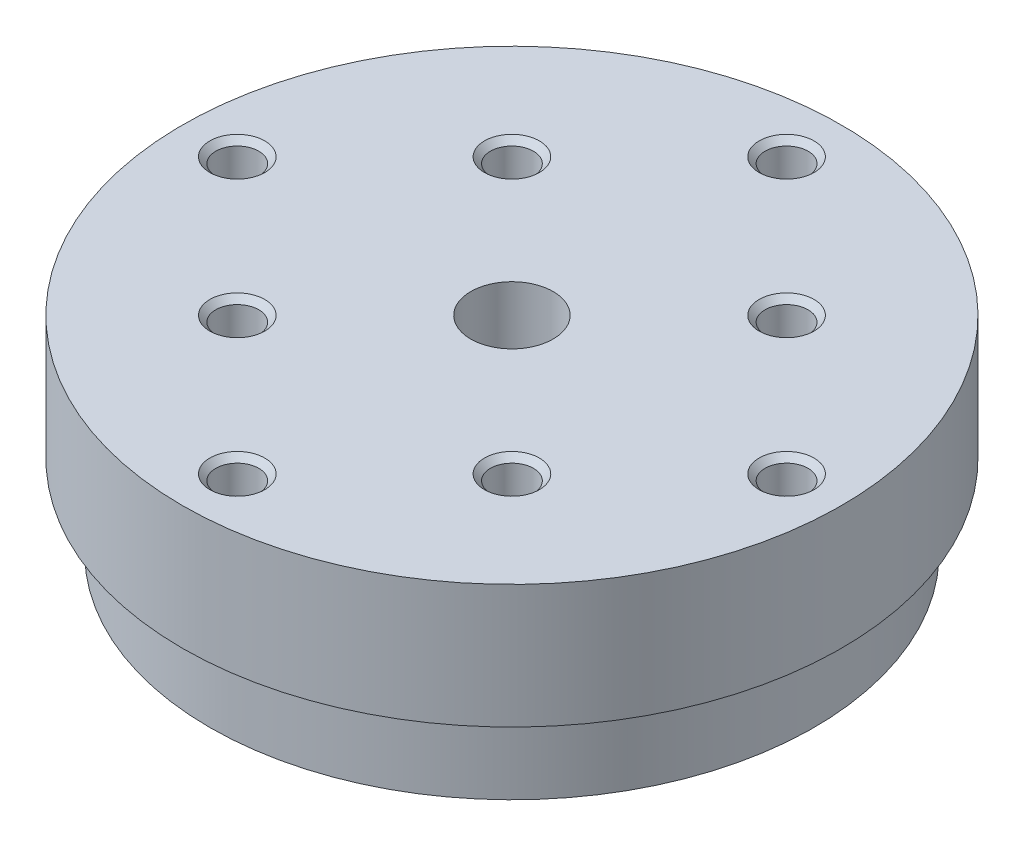
ISO-10303-21;
HEADER;
FILE_DESCRIPTION(('STEP AP214'),'2;1');
FILE_NAME('part.step','',(''),(''),'','','');
FILE_SCHEMA(('AUTOMOTIVE_DESIGN { 1 0 10303 214 1 1 1 1 }'));
ENDSEC;
DATA;
#1=APPLICATION_CONTEXT('core data for automotive mechanical design processes');
#2=APPLICATION_PROTOCOL_DEFINITION('international standard','automotive_design',2000,#1);
#3=PRODUCT_CONTEXT('',#1,'mechanical');
#4=PRODUCT('Part','Part','',(#3));
#5=PRODUCT_RELATED_PRODUCT_CATEGORY('part','',(#4));
#6=PRODUCT_DEFINITION_FORMATION('','',#4);
#7=PRODUCT_DEFINITION_CONTEXT('part definition',#1,'design');
#8=PRODUCT_DEFINITION('design','',#6,#7);
#9=PRODUCT_DEFINITION_SHAPE('','',#8);
#10=(LENGTH_UNIT() NAMED_UNIT(*) SI_UNIT(.MILLI.,.METRE.));
#11=(NAMED_UNIT(*) PLANE_ANGLE_UNIT() SI_UNIT($,.RADIAN.));
#12=(NAMED_UNIT(*) SI_UNIT($,.STERADIAN.) SOLID_ANGLE_UNIT());
#13=UNCERTAINTY_MEASURE_WITH_UNIT(LENGTH_MEASURE(1.E-05),#10,'distance_accuracy_value','');
#14=(GEOMETRIC_REPRESENTATION_CONTEXT(3) GLOBAL_UNCERTAINTY_ASSIGNED_CONTEXT((#13)) GLOBAL_UNIT_ASSIGNED_CONTEXT((#10,
#11,#12)) REPRESENTATION_CONTEXT('',''));
#15=CARTESIAN_POINT('',(0.,0.,0.));
#16=DIRECTION('',(0.,0.,1.));
#17=DIRECTION('',(1.,0.,0.));
#18=AXIS2_PLACEMENT_3D('',#15,#16,#17);
#19=CARTESIAN_POINT('',(0.,4.5,0.));
#20=DIRECTION('',(0.,-1.,0.));
#21=DIRECTION('',(0.,0.,-1.));
#22=AXIS2_PLACEMENT_3D('',#19,#20,#21);
#23=PLANE('',#22);
#24=CARTESIAN_POINT('',(-5.,4.5,-5.));
#25=DIRECTION('',(0.,1.,0.));
#26=DIRECTION('',(0.,0.,1.));
#27=AXIS2_PLACEMENT_3D('',#24,#25,#26);
#28=CIRCLE('',#27,0.999999999999999);
#29=CARTESIAN_POINT('',(-5.,4.5,-4.));
#30=VERTEX_POINT('',#29);
#31=EDGE_CURVE('E94',#30,#30,#28,.T.);
#32=ORIENTED_EDGE('',*,*,#31,.F.);
#33=EDGE_LOOP('',(#32));
#34=FACE_BOUND('',#33,.T.);
#35=CARTESIAN_POINT('',(-5.,4.5,5.));
#36=DIRECTION('',(0.,1.,0.));
#37=DIRECTION('',(0.,0.,1.));
#38=AXIS2_PLACEMENT_3D('',#35,#36,#37);
#39=CIRCLE('',#38,0.999999999999999);
#40=CARTESIAN_POINT('',(-5.,4.5,6.));
#41=VERTEX_POINT('',#40);
#42=EDGE_CURVE('E98',#41,#41,#39,.T.);
#43=ORIENTED_EDGE('',*,*,#42,.F.);
#44=EDGE_LOOP('',(#43));
#45=FACE_BOUND('',#44,.T.);
#46=CARTESIAN_POINT('',(0.,4.5,10.));
#47=DIRECTION('',(0.,1.,0.));
#48=DIRECTION('',(0.,0.,1.));
#49=AXIS2_PLACEMENT_3D('',#46,#47,#48);
#50=CIRCLE('',#49,0.999999999999999);
#51=CARTESIAN_POINT('',(0.,4.5,11.));
#52=VERTEX_POINT('',#51);
#53=EDGE_CURVE('E102',#52,#52,#50,.T.);
#54=ORIENTED_EDGE('',*,*,#53,.F.);
#55=EDGE_LOOP('',(#54));
#56=FACE_BOUND('',#55,.T.);
#57=CARTESIAN_POINT('',(10.,4.5,0.));
#58=DIRECTION('',(0.,1.,0.));
#59=DIRECTION('',(0.,0.,1.));
#60=AXIS2_PLACEMENT_3D('',#57,#58,#59);
#61=CIRCLE('',#60,0.999999999999999);
#62=CARTESIAN_POINT('',(10.,4.5,0.999999999999999));
#63=VERTEX_POINT('',#62);
#64=EDGE_CURVE('E106',#63,#63,#61,.T.);
#65=ORIENTED_EDGE('',*,*,#64,.F.);
#66=EDGE_LOOP('',(#65));
#67=FACE_BOUND('',#66,.T.);
#68=CARTESIAN_POINT('',(0.,4.5,0.));
#69=DIRECTION('',(0.,1.,0.));
#70=DIRECTION('',(0.,0.,1.));
#71=AXIS2_PLACEMENT_3D('',#68,#69,#70);
#72=CIRCLE('',#71,12.);
#73=CARTESIAN_POINT('',(0.,4.5,12.));
#74=VERTEX_POINT('',#73);
#75=EDGE_CURVE('E11',#74,#74,#72,.T.);
#76=ORIENTED_EDGE('',*,*,#75,.T.);
#77=EDGE_LOOP('',(#76));
#78=FACE_BOUND('',#77,.T.);
#79=CARTESIAN_POINT('',(0.,4.5,0.));
#80=DIRECTION('',(0.,1.,0.));
#81=DIRECTION('',(0.,0.,1.));
#82=AXIS2_PLACEMENT_3D('',#79,#80,#81);
#83=CIRCLE('',#82,1.5);
#84=CARTESIAN_POINT('',(0.,4.5,1.5));
#85=VERTEX_POINT('',#84);
#86=EDGE_CURVE('E112',#85,#85,#83,.T.);
#87=ORIENTED_EDGE('',*,*,#86,.F.);
#88=EDGE_LOOP('',(#87));
#89=FACE_BOUND('',#88,.T.);
#90=CARTESIAN_POINT('',(5.,4.5,5.));
#91=DIRECTION('',(0.,1.,0.));
#92=DIRECTION('',(0.,0.,1.));
#93=AXIS2_PLACEMENT_3D('',#90,#91,#92);
#94=CIRCLE('',#93,0.999999999999999);
#95=CARTESIAN_POINT('',(5.,4.5,6.));
#96=VERTEX_POINT('',#95);
#97=EDGE_CURVE('E116',#96,#96,#94,.T.);
#98=ORIENTED_EDGE('',*,*,#97,.F.);
#99=EDGE_LOOP('',(#98));
#100=FACE_BOUND('',#99,.T.);
#101=CARTESIAN_POINT('',(5.,4.5,-5.));
#102=DIRECTION('',(0.,1.,0.));
#103=DIRECTION('',(0.,0.,1.));
#104=AXIS2_PLACEMENT_3D('',#101,#102,#103);
#105=CIRCLE('',#104,0.999999999999999);
#106=CARTESIAN_POINT('',(5.,4.5,-4.));
#107=VERTEX_POINT('',#106);
#108=EDGE_CURVE('E120',#107,#107,#105,.T.);
#109=ORIENTED_EDGE('',*,*,#108,.F.);
#110=EDGE_LOOP('',(#109));
#111=FACE_BOUND('',#110,.T.);
#112=CARTESIAN_POINT('',(0.,4.5,-10.));
#113=DIRECTION('',(0.,1.,0.));
#114=DIRECTION('',(0.,0.,1.));
#115=AXIS2_PLACEMENT_3D('',#112,#113,#114);
#116=CIRCLE('',#115,0.999999999999999);
#117=CARTESIAN_POINT('',(0.,4.5,-9.));
#118=VERTEX_POINT('',#117);
#119=EDGE_CURVE('E124',#118,#118,#116,.T.);
#120=ORIENTED_EDGE('',*,*,#119,.F.);
#121=EDGE_LOOP('',(#120));
#122=FACE_BOUND('',#121,.T.);
#123=CARTESIAN_POINT('',(-10.,4.5,0.));
#124=DIRECTION('',(0.,1.,0.));
#125=DIRECTION('',(0.,0.,1.));
#126=AXIS2_PLACEMENT_3D('',#123,#124,#125);
#127=CIRCLE('',#126,0.999999999999999);
#128=CARTESIAN_POINT('',(-10.,4.5,1.));
#129=VERTEX_POINT('',#128);
#130=EDGE_CURVE('E127',#129,#129,#127,.T.);
#131=ORIENTED_EDGE('',*,*,#130,.F.);
#132=EDGE_LOOP('',(#131));
#133=FACE_BOUND('',#132,.T.);
#134=ADVANCED_FACE('F37',(#34,#45,#56,#67,#78,#89,#100,#111,#122,#133),#23,.F.);
#135=CARTESIAN_POINT('',(11.,-3.,0.));
#136=DIRECTION('',(0.,1.,0.));
#137=DIRECTION('',(0.,0.,1.));
#138=AXIS2_PLACEMENT_3D('',#135,#136,#137);
#139=PLANE('',#138);
#140=CARTESIAN_POINT('',(0.,-3.,0.));
#141=DIRECTION('',(0.,1.,0.));
#142=DIRECTION('',(0.,0.,1.));
#143=AXIS2_PLACEMENT_3D('',#140,#141,#142);
#144=CIRCLE('',#143,11.);
#145=CARTESIAN_POINT('',(0.,-3.,11.));
#146=VERTEX_POINT('',#145);
#147=EDGE_CURVE('E186',#146,#146,#144,.T.);
#148=ORIENTED_EDGE('',*,*,#147,.F.);
#149=EDGE_LOOP('',(#148));
#150=FACE_BOUND('',#149,.T.);
#151=CARTESIAN_POINT('',(0.,-3.,0.));
#152=DIRECTION('',(0.,1.,0.));
#153=DIRECTION('',(0.,0.,1.));
#154=AXIS2_PLACEMENT_3D('',#151,#152,#153);
#155=CIRCLE('',#154,1.5);
#156=CARTESIAN_POINT('',(0.,-3.,1.5));
#157=VERTEX_POINT('',#156);
#158=EDGE_CURVE('E40',#157,#157,#155,.F.);
#159=ORIENTED_EDGE('',*,*,#158,.F.);
#160=EDGE_LOOP('',(#159));
#161=FACE_BOUND('',#160,.T.);
#162=ADVANCED_FACE('F83',(#150,#161),#139,.F.);
#163=CARTESIAN_POINT('',(0.,-3.,0.));
#164=DIRECTION('',(0.,1.,0.));
#165=DIRECTION('',(0.,0.,1.));
#166=AXIS2_PLACEMENT_3D('',#163,#164,#165);
#167=CYLINDRICAL_SURFACE('',#166,12.);
#168=ORIENTED_EDGE('',*,*,#75,.F.);
#169=EDGE_LOOP('',(#168));
#170=FACE_BOUND('',#169,.T.);
#171=CARTESIAN_POINT('',(0.,0.,0.));
#172=DIRECTION('',(0.,1.,0.));
#173=DIRECTION('',(0.,0.,1.));
#174=AXIS2_PLACEMENT_3D('',#171,#172,#173);
#175=CIRCLE('',#174,12.);
#176=CARTESIAN_POINT('',(0.,0.,12.));
#177=VERTEX_POINT('',#176);
#178=EDGE_CURVE('E45',#177,#177,#175,.T.);
#179=ORIENTED_EDGE('',*,*,#178,.T.);
#180=EDGE_LOOP('',(#179));
#181=FACE_BOUND('',#180,.T.);
#182=ADVANCED_FACE('F88',(#170,#181),#167,.T.);
#183=CARTESIAN_POINT('',(12.,0.,0.));
#184=DIRECTION('',(0.,1.,0.));
#185=DIRECTION('',(0.,0.,1.));
#186=AXIS2_PLACEMENT_3D('',#183,#184,#185);
#187=PLANE('',#186);
#188=ORIENTED_EDGE('',*,*,#178,.F.);
#189=EDGE_LOOP('',(#188));
#190=FACE_BOUND('',#189,.T.);
#191=CARTESIAN_POINT('',(0.,0.,0.));
#192=DIRECTION('',(0.,1.,0.));
#193=DIRECTION('',(0.,0.,1.));
#194=AXIS2_PLACEMENT_3D('',#191,#192,#193);
#195=CIRCLE('',#194,11.);
#196=CARTESIAN_POINT('',(0.,0.,11.));
#197=VERTEX_POINT('',#196);
#198=EDGE_CURVE('E189',#197,#197,#195,.T.);
#199=ORIENTED_EDGE('',*,*,#198,.T.);
#200=EDGE_LOOP('',(#199));
#201=FACE_BOUND('',#200,.T.);
#202=ADVANCED_FACE('F196',(#190,#201),#187,.F.);
#203=CARTESIAN_POINT('',(0.,-3.,0.));
#204=DIRECTION('',(0.,1.,0.));
#205=DIRECTION('',(0.,0.,1.));
#206=AXIS2_PLACEMENT_3D('',#203,#204,#205);
#207=CYLINDRICAL_SURFACE('',#206,11.);
#208=ORIENTED_EDGE('',*,*,#198,.F.);
#209=EDGE_LOOP('',(#208));
#210=FACE_BOUND('',#209,.T.);
#211=ORIENTED_EDGE('',*,*,#147,.T.);
#212=EDGE_LOOP('',(#211));
#213=FACE_BOUND('',#212,.T.);
#214=ADVANCED_FACE('F199',(#210,#213),#207,.T.);
#215=CARTESIAN_POINT('',(0.,-10.5,0.));
#216=DIRECTION('',(0.,1.,0.));
#217=DIRECTION('',(0.,0.,1.));
#218=AXIS2_PLACEMENT_3D('',#215,#216,#217);
#219=CYLINDRICAL_SURFACE('',#218,1.5);
#220=ORIENTED_EDGE('',*,*,#86,.T.);
#221=EDGE_LOOP('',(#220));
#222=FACE_BOUND('',#221,.T.);
#223=ORIENTED_EDGE('',*,*,#158,.T.);
#224=EDGE_LOOP('',(#223));
#225=FACE_BOUND('',#224,.T.);
#226=ADVANCED_FACE('F205',(#222,#225),#219,.F.);
#227=CARTESIAN_POINT('',(10.,4.2835,0.));
#228=DIRECTION('',(0.,1.,0.));
#229=DIRECTION('',(0.,0.,1.));
#230=AXIS2_PLACEMENT_3D('',#227,#228,#229);
#231=CONICAL_SURFACE('',#230,0.783499999999999,0.785398163397446);
#232=ORIENTED_EDGE('',*,*,#64,.T.);
#233=EDGE_LOOP('',(#232));
#234=FACE_BOUND('',#233,.T.);
#235=CARTESIAN_POINT('',(10.,4.2835,0.));
#236=DIRECTION('',(0.,1.,0.));
#237=DIRECTION('',(0.,0.,1.));
#238=AXIS2_PLACEMENT_3D('',#235,#236,#237);
#239=CIRCLE('',#238,0.783499999999999);
#240=CARTESIAN_POINT('',(10.,4.2835,0.783499999999999));
#241=VERTEX_POINT('',#240);
#242=EDGE_CURVE('E181',#241,#241,#239,.T.);
#243=ORIENTED_EDGE('',*,*,#242,.F.);
#244=EDGE_LOOP('',(#243));
#245=FACE_BOUND('',#244,.T.);
#246=ADVANCED_FACE('F213',(#234,#245),#231,.F.);
#247=CARTESIAN_POINT('',(10.,0.75,0.));
#248=DIRECTION('',(0.,1.,0.));
#249=DIRECTION('',(0.,0.,1.));
#250=AXIS2_PLACEMENT_3D('',#247,#248,#249);
#251=CYLINDRICAL_SURFACE('',#250,0.783499999999999);
#252=ORIENTED_EDGE('',*,*,#242,.T.);
#253=EDGE_LOOP('',(#252));
#254=FACE_BOUND('',#253,.T.);
#255=CARTESIAN_POINT('',(10.,1.20235393591007,0.));
#256=DIRECTION('',(0.,1.,0.));
#257=DIRECTION('',(0.,0.,1.));
#258=AXIS2_PLACEMENT_3D('',#255,#256,#257);
#259=CIRCLE('',#258,0.783499999999999);
#260=CARTESIAN_POINT('',(10.,1.20235393591007,0.783499999999999));
#261=VERTEX_POINT('',#260);
#262=EDGE_CURVE('E178',#261,#261,#259,.T.);
#263=ORIENTED_EDGE('',*,*,#262,.F.);
#264=EDGE_LOOP('',(#263));
#265=FACE_BOUND('',#264,.T.);
#266=ADVANCED_FACE('F219',(#254,#265),#251,.F.);
#267=CARTESIAN_POINT('',(10.,0.75,0.));
#268=DIRECTION('',(0.,1.,0.));
#269=DIRECTION('',(0.,0.,1.));
#270=AXIS2_PLACEMENT_3D('',#267,#268,#269);
#271=CONICAL_SURFACE('',#270,0.,1.0471975511966);
#272=ORIENTED_EDGE('',*,*,#262,.T.);
#273=EDGE_LOOP('',(#272));
#274=FACE_BOUND('',#273,.T.);
#275=CARTESIAN_POINT('',(10.,0.75,0.));
#276=VERTEX_POINT('',#275);
#277=VERTEX_LOOP('',#276);
#278=FACE_BOUND('',#277,.T.);
#279=ADVANCED_FACE('F261',(#274,#278),#271,.F.);
#280=CARTESIAN_POINT('',(5.,4.2835,5.));
#281=DIRECTION('',(0.,1.,0.));
#282=DIRECTION('',(0.,0.,1.));
#283=AXIS2_PLACEMENT_3D('',#280,#281,#282);
#284=CONICAL_SURFACE('',#283,0.783499999999999,0.785398163397446);
#285=ORIENTED_EDGE('',*,*,#97,.T.);
#286=EDGE_LOOP('',(#285));
#287=FACE_BOUND('',#286,.T.);
#288=CARTESIAN_POINT('',(5.,4.2835,5.));
#289=DIRECTION('',(0.,1.,0.));
#290=DIRECTION('',(0.,0.,1.));
#291=AXIS2_PLACEMENT_3D('',#288,#289,#290);
#292=CIRCLE('',#291,0.783499999999999);
#293=CARTESIAN_POINT('',(5.,4.2835,5.7835));
#294=VERTEX_POINT('',#293);
#295=EDGE_CURVE('E174',#294,#294,#292,.T.);
#296=ORIENTED_EDGE('',*,*,#295,.F.);
#297=EDGE_LOOP('',(#296));
#298=FACE_BOUND('',#297,.T.);
#299=ADVANCED_FACE('F271',(#287,#298),#284,.F.);
#300=CARTESIAN_POINT('',(5.,0.75,5.));
#301=DIRECTION('',(0.,1.,0.));
#302=DIRECTION('',(0.,0.,1.));
#303=AXIS2_PLACEMENT_3D('',#300,#301,#302);
#304=CYLINDRICAL_SURFACE('',#303,0.783499999999999);
#305=ORIENTED_EDGE('',*,*,#295,.T.);
#306=EDGE_LOOP('',(#305));
#307=FACE_BOUND('',#306,.T.);
#308=CARTESIAN_POINT('',(5.,1.20235393591007,5.));
#309=DIRECTION('',(0.,1.,0.));
#310=DIRECTION('',(0.,0.,1.));
#311=AXIS2_PLACEMENT_3D('',#308,#309,#310);
#312=CIRCLE('',#311,0.783499999999999);
#313=CARTESIAN_POINT('',(5.,1.20235393591007,5.7835));
#314=VERTEX_POINT('',#313);
#315=EDGE_CURVE('E171',#314,#314,#312,.T.);
#316=ORIENTED_EDGE('',*,*,#315,.F.);
#317=EDGE_LOOP('',(#316));
#318=FACE_BOUND('',#317,.T.);
#319=ADVANCED_FACE('F286',(#307,#318),#304,.F.);
#320=CARTESIAN_POINT('',(5.,0.75,5.));
#321=DIRECTION('',(0.,1.,0.));
#322=DIRECTION('',(0.,0.,1.));
#323=AXIS2_PLACEMENT_3D('',#320,#321,#322);
#324=CONICAL_SURFACE('',#323,0.,1.0471975511966);
#325=ORIENTED_EDGE('',*,*,#315,.T.);
#326=EDGE_LOOP('',(#325));
#327=FACE_BOUND('',#326,.T.);
#328=CARTESIAN_POINT('',(5.,0.75,5.));
#329=VERTEX_POINT('',#328);
#330=VERTEX_LOOP('',#329);
#331=FACE_BOUND('',#330,.T.);
#332=ADVANCED_FACE('F297',(#327,#331),#324,.F.);
#333=CARTESIAN_POINT('',(0.,4.2835,10.));
#334=DIRECTION('',(0.,1.,0.));
#335=DIRECTION('',(0.,0.,1.));
#336=AXIS2_PLACEMENT_3D('',#333,#334,#335);
#337=CONICAL_SURFACE('',#336,0.783499999999999,0.785398163397446);
#338=ORIENTED_EDGE('',*,*,#53,.T.);
#339=EDGE_LOOP('',(#338));
#340=FACE_BOUND('',#339,.T.);
#341=CARTESIAN_POINT('',(0.,4.2835,10.));
#342=DIRECTION('',(0.,1.,0.));
#343=DIRECTION('',(0.,0.,1.));
#344=AXIS2_PLACEMENT_3D('',#341,#342,#343);
#345=CIRCLE('',#344,0.783499999999999);
#346=CARTESIAN_POINT('',(0.,4.2835,10.7835));
#347=VERTEX_POINT('',#346);
#348=EDGE_CURVE('E167',#347,#347,#345,.T.);
#349=ORIENTED_EDGE('',*,*,#348,.F.);
#350=EDGE_LOOP('',(#349));
#351=FACE_BOUND('',#350,.T.);
#352=ADVANCED_FACE('F310',(#340,#351),#337,.F.);
#353=CARTESIAN_POINT('',(0.,0.75,10.));
#354=DIRECTION('',(0.,1.,0.));
#355=DIRECTION('',(0.,0.,1.));
#356=AXIS2_PLACEMENT_3D('',#353,#354,#355);
#357=CYLINDRICAL_SURFACE('',#356,0.783499999999999);
#358=ORIENTED_EDGE('',*,*,#348,.T.);
#359=EDGE_LOOP('',(#358));
#360=FACE_BOUND('',#359,.T.);
#361=CARTESIAN_POINT('',(0.,1.20235393591007,10.));
#362=DIRECTION('',(0.,1.,0.));
#363=DIRECTION('',(0.,0.,1.));
#364=AXIS2_PLACEMENT_3D('',#361,#362,#363);
#365=CIRCLE('',#364,0.783499999999999);
#366=CARTESIAN_POINT('',(0.,1.20235393591007,10.7835));
#367=VERTEX_POINT('',#366);
#368=EDGE_CURVE('E164',#367,#367,#365,.T.);
#369=ORIENTED_EDGE('',*,*,#368,.F.);
#370=EDGE_LOOP('',(#369));
#371=FACE_BOUND('',#370,.T.);
#372=ADVANCED_FACE('F320',(#360,#371),#357,.F.);
#373=CARTESIAN_POINT('',(0.,0.75,10.));
#374=DIRECTION('',(0.,1.,0.));
#375=DIRECTION('',(0.,0.,1.));
#376=AXIS2_PLACEMENT_3D('',#373,#374,#375);
#377=CONICAL_SURFACE('',#376,0.,1.0471975511966);
#378=ORIENTED_EDGE('',*,*,#368,.T.);
#379=EDGE_LOOP('',(#378));
#380=FACE_BOUND('',#379,.T.);
#381=CARTESIAN_POINT('',(0.,0.75,10.));
#382=VERTEX_POINT('',#381);
#383=VERTEX_LOOP('',#382);
#384=FACE_BOUND('',#383,.T.);
#385=ADVANCED_FACE('F331',(#380,#384),#377,.F.);
#386=CARTESIAN_POINT('',(5.,4.2835,-5.));
#387=DIRECTION('',(0.,1.,0.));
#388=DIRECTION('',(0.,0.,1.));
#389=AXIS2_PLACEMENT_3D('',#386,#387,#388);
#390=CONICAL_SURFACE('',#389,0.783499999999999,0.785398163397446);
#391=ORIENTED_EDGE('',*,*,#108,.T.);
#392=EDGE_LOOP('',(#391));
#393=FACE_BOUND('',#392,.T.);
#394=CARTESIAN_POINT('',(5.,4.2835,-5.));
#395=DIRECTION('',(0.,1.,0.));
#396=DIRECTION('',(0.,0.,1.));
#397=AXIS2_PLACEMENT_3D('',#394,#395,#396);
#398=CIRCLE('',#397,0.783499999999999);
#399=CARTESIAN_POINT('',(5.,4.2835,-4.2165));
#400=VERTEX_POINT('',#399);
#401=EDGE_CURVE('E160',#400,#400,#398,.T.);
#402=ORIENTED_EDGE('',*,*,#401,.F.);
#403=EDGE_LOOP('',(#402));
#404=FACE_BOUND('',#403,.T.);
#405=ADVANCED_FACE('F344',(#393,#404),#390,.F.);
#406=CARTESIAN_POINT('',(5.,0.75,-5.));
#407=DIRECTION('',(0.,1.,0.));
#408=DIRECTION('',(0.,0.,1.));
#409=AXIS2_PLACEMENT_3D('',#406,#407,#408);
#410=CYLINDRICAL_SURFACE('',#409,0.783499999999999);
#411=ORIENTED_EDGE('',*,*,#401,.T.);
#412=EDGE_LOOP('',(#411));
#413=FACE_BOUND('',#412,.T.);
#414=CARTESIAN_POINT('',(5.,1.20235393591007,-5.));
#415=DIRECTION('',(0.,1.,0.));
#416=DIRECTION('',(0.,0.,1.));
#417=AXIS2_PLACEMENT_3D('',#414,#415,#416);
#418=CIRCLE('',#417,0.783499999999999);
#419=CARTESIAN_POINT('',(5.,1.20235393591007,-4.2165));
#420=VERTEX_POINT('',#419);
#421=EDGE_CURVE('E157',#420,#420,#418,.T.);
#422=ORIENTED_EDGE('',*,*,#421,.F.);
#423=EDGE_LOOP('',(#422));
#424=FACE_BOUND('',#423,.T.);
#425=ADVANCED_FACE('F354',(#413,#424),#410,.F.);
#426=CARTESIAN_POINT('',(5.,0.75,-5.));
#427=DIRECTION('',(0.,1.,0.));
#428=DIRECTION('',(0.,0.,1.));
#429=AXIS2_PLACEMENT_3D('',#426,#427,#428);
#430=CONICAL_SURFACE('',#429,0.,1.0471975511966);
#431=ORIENTED_EDGE('',*,*,#421,.T.);
#432=EDGE_LOOP('',(#431));
#433=FACE_BOUND('',#432,.T.);
#434=CARTESIAN_POINT('',(5.,0.75,-5.));
#435=VERTEX_POINT('',#434);
#436=VERTEX_LOOP('',#435);
#437=FACE_BOUND('',#436,.T.);
#438=ADVANCED_FACE('F364',(#433,#437),#430,.F.);
#439=CARTESIAN_POINT('',(-5.,4.2835,5.));
#440=DIRECTION('',(0.,1.,0.));
#441=DIRECTION('',(0.,0.,1.));
#442=AXIS2_PLACEMENT_3D('',#439,#440,#441);
#443=CONICAL_SURFACE('',#442,0.783499999999999,0.785398163397446);
#444=ORIENTED_EDGE('',*,*,#42,.T.);
#445=EDGE_LOOP('',(#444));
#446=FACE_BOUND('',#445,.T.);
#447=CARTESIAN_POINT('',(-5.,4.2835,5.));
#448=DIRECTION('',(0.,1.,0.));
#449=DIRECTION('',(0.,0.,1.));
#450=AXIS2_PLACEMENT_3D('',#447,#448,#449);
#451=CIRCLE('',#450,0.783499999999999);
#452=CARTESIAN_POINT('',(-5.,4.2835,5.7835));
#453=VERTEX_POINT('',#452);
#454=EDGE_CURVE('E153',#453,#453,#451,.T.);
#455=ORIENTED_EDGE('',*,*,#454,.F.);
#456=EDGE_LOOP('',(#455));
#457=FACE_BOUND('',#456,.T.);
#458=ADVANCED_FACE('F375',(#446,#457),#443,.F.);
#459=CARTESIAN_POINT('',(-5.,0.75,5.));
#460=DIRECTION('',(0.,1.,0.));
#461=DIRECTION('',(0.,0.,1.));
#462=AXIS2_PLACEMENT_3D('',#459,#460,#461);
#463=CYLINDRICAL_SURFACE('',#462,0.783499999999999);
#464=ORIENTED_EDGE('',*,*,#454,.T.);
#465=EDGE_LOOP('',(#464));
#466=FACE_BOUND('',#465,.T.);
#467=CARTESIAN_POINT('',(-5.,1.20235393591007,5.));
#468=DIRECTION('',(0.,1.,0.));
#469=DIRECTION('',(0.,0.,1.));
#470=AXIS2_PLACEMENT_3D('',#467,#468,#469);
#471=CIRCLE('',#470,0.783499999999999);
#472=CARTESIAN_POINT('',(-5.,1.20235393591007,5.7835));
#473=VERTEX_POINT('',#472);
#474=EDGE_CURVE('E150',#473,#473,#471,.T.);
#475=ORIENTED_EDGE('',*,*,#474,.F.);
#476=EDGE_LOOP('',(#475));
#477=FACE_BOUND('',#476,.T.);
#478=ADVANCED_FACE('F385',(#466,#477),#463,.F.);
#479=CARTESIAN_POINT('',(-5.,0.75,5.));
#480=DIRECTION('',(0.,1.,0.));
#481=DIRECTION('',(0.,0.,1.));
#482=AXIS2_PLACEMENT_3D('',#479,#480,#481);
#483=CONICAL_SURFACE('',#482,0.,1.0471975511966);
#484=ORIENTED_EDGE('',*,*,#474,.T.);
#485=EDGE_LOOP('',(#484));
#486=FACE_BOUND('',#485,.T.);
#487=CARTESIAN_POINT('',(-5.,0.75,5.));
#488=VERTEX_POINT('',#487);
#489=VERTEX_LOOP('',#488);
#490=FACE_BOUND('',#489,.T.);
#491=ADVANCED_FACE('F395',(#486,#490),#483,.F.);
#492=CARTESIAN_POINT('',(0.,4.2835,-10.));
#493=DIRECTION('',(0.,1.,0.));
#494=DIRECTION('',(0.,0.,1.));
#495=AXIS2_PLACEMENT_3D('',#492,#493,#494);
#496=CONICAL_SURFACE('',#495,0.783499999999999,0.785398163397446);
#497=ORIENTED_EDGE('',*,*,#119,.T.);
#498=EDGE_LOOP('',(#497));
#499=FACE_BOUND('',#498,.T.);
#500=CARTESIAN_POINT('',(0.,4.2835,-10.));
#501=DIRECTION('',(0.,1.,0.));
#502=DIRECTION('',(0.,0.,1.));
#503=AXIS2_PLACEMENT_3D('',#500,#501,#502);
#504=CIRCLE('',#503,0.783499999999999);
#505=CARTESIAN_POINT('',(0.,4.2835,-9.2165));
#506=VERTEX_POINT('',#505);
#507=EDGE_CURVE('E146',#506,#506,#504,.T.);
#508=ORIENTED_EDGE('',*,*,#507,.F.);
#509=EDGE_LOOP('',(#508));
#510=FACE_BOUND('',#509,.T.);
#511=ADVANCED_FACE('F406',(#499,#510),#496,.F.);
#512=CARTESIAN_POINT('',(0.,0.75,-10.));
#513=DIRECTION('',(0.,1.,0.));
#514=DIRECTION('',(0.,0.,1.));
#515=AXIS2_PLACEMENT_3D('',#512,#513,#514);
#516=CYLINDRICAL_SURFACE('',#515,0.783499999999999);
#517=ORIENTED_EDGE('',*,*,#507,.T.);
#518=EDGE_LOOP('',(#517));
#519=FACE_BOUND('',#518,.T.);
#520=CARTESIAN_POINT('',(0.,1.20235393591007,-10.));
#521=DIRECTION('',(0.,1.,0.));
#522=DIRECTION('',(0.,0.,1.));
#523=AXIS2_PLACEMENT_3D('',#520,#521,#522);
#524=CIRCLE('',#523,0.783499999999999);
#525=CARTESIAN_POINT('',(0.,1.20235393591007,-9.2165));
#526=VERTEX_POINT('',#525);
#527=EDGE_CURVE('E143',#526,#526,#524,.T.);
#528=ORIENTED_EDGE('',*,*,#527,.F.);
#529=EDGE_LOOP('',(#528));
#530=FACE_BOUND('',#529,.T.);
#531=ADVANCED_FACE('F416',(#519,#530),#516,.F.);
#532=CARTESIAN_POINT('',(0.,0.75,-10.));
#533=DIRECTION('',(0.,1.,0.));
#534=DIRECTION('',(0.,0.,1.));
#535=AXIS2_PLACEMENT_3D('',#532,#533,#534);
#536=CONICAL_SURFACE('',#535,0.,1.0471975511966);
#537=ORIENTED_EDGE('',*,*,#527,.T.);
#538=EDGE_LOOP('',(#537));
#539=FACE_BOUND('',#538,.T.);
#540=CARTESIAN_POINT('',(0.,0.75,-10.));
#541=VERTEX_POINT('',#540);
#542=VERTEX_LOOP('',#541);
#543=FACE_BOUND('',#542,.T.);
#544=ADVANCED_FACE('F426',(#539,#543),#536,.F.);
#545=CARTESIAN_POINT('',(-5.,4.2835,-5.));
#546=DIRECTION('',(0.,1.,0.));
#547=DIRECTION('',(0.,0.,1.));
#548=AXIS2_PLACEMENT_3D('',#545,#546,#547);
#549=CONICAL_SURFACE('',#548,0.783499999999999,0.785398163397446);
#550=ORIENTED_EDGE('',*,*,#31,.T.);
#551=EDGE_LOOP('',(#550));
#552=FACE_BOUND('',#551,.T.);
#553=CARTESIAN_POINT('',(-5.,4.2835,-5.));
#554=DIRECTION('',(0.,1.,0.));
#555=DIRECTION('',(0.,0.,1.));
#556=AXIS2_PLACEMENT_3D('',#553,#554,#555);
#557=CIRCLE('',#556,0.783499999999999);
#558=CARTESIAN_POINT('',(-5.,4.2835,-4.2165));
#559=VERTEX_POINT('',#558);
#560=EDGE_CURVE('E133',#559,#559,#557,.T.);
#561=ORIENTED_EDGE('',*,*,#560,.F.);
#562=EDGE_LOOP('',(#561));
#563=FACE_BOUND('',#562,.T.);
#564=ADVANCED_FACE('F437',(#552,#563),#549,.F.);
#565=CARTESIAN_POINT('',(-5.,0.75,-5.));
#566=DIRECTION('',(0.,1.,0.));
#567=DIRECTION('',(0.,0.,1.));
#568=AXIS2_PLACEMENT_3D('',#565,#566,#567);
#569=CYLINDRICAL_SURFACE('',#568,0.783499999999999);
#570=ORIENTED_EDGE('',*,*,#560,.T.);
#571=EDGE_LOOP('',(#570));
#572=FACE_BOUND('',#571,.T.);
#573=CARTESIAN_POINT('',(-5.,1.20235393591007,-5.));
#574=DIRECTION('',(0.,1.,0.));
#575=DIRECTION('',(0.,0.,1.));
#576=AXIS2_PLACEMENT_3D('',#573,#574,#575);
#577=CIRCLE('',#576,0.783499999999999);
#578=CARTESIAN_POINT('',(-5.,1.20235393591007,-4.2165));
#579=VERTEX_POINT('',#578);
#580=EDGE_CURVE('E129',#579,#579,#577,.T.);
#581=ORIENTED_EDGE('',*,*,#580,.F.);
#582=EDGE_LOOP('',(#581));
#583=FACE_BOUND('',#582,.T.);
#584=ADVANCED_FACE('F447',(#572,#583),#569,.F.);
#585=CARTESIAN_POINT('',(-5.,0.75,-5.));
#586=DIRECTION('',(0.,1.,0.));
#587=DIRECTION('',(0.,0.,1.));
#588=AXIS2_PLACEMENT_3D('',#585,#586,#587);
#589=CONICAL_SURFACE('',#588,0.,1.0471975511966);
#590=ORIENTED_EDGE('',*,*,#580,.T.);
#591=EDGE_LOOP('',(#590));
#592=FACE_BOUND('',#591,.T.);
#593=CARTESIAN_POINT('',(-5.,0.75,-5.));
#594=VERTEX_POINT('',#593);
#595=VERTEX_LOOP('',#594);
#596=FACE_BOUND('',#595,.T.);
#597=ADVANCED_FACE('F457',(#592,#596),#589,.F.);
#598=CARTESIAN_POINT('',(-10.,4.2835,0.));
#599=DIRECTION('',(0.,1.,0.));
#600=DIRECTION('',(0.,0.,1.));
#601=AXIS2_PLACEMENT_3D('',#598,#599,#600);
#602=CONICAL_SURFACE('',#601,0.783499999999999,0.785398163397446);
#603=ORIENTED_EDGE('',*,*,#130,.T.);
#604=EDGE_LOOP('',(#603));
#605=FACE_BOUND('',#604,.T.);
#606=CARTESIAN_POINT('',(-10.,4.2835,0.));
#607=DIRECTION('',(0.,1.,0.));
#608=DIRECTION('',(0.,0.,1.));
#609=AXIS2_PLACEMENT_3D('',#606,#607,#608);
#610=CIRCLE('',#609,0.783499999999999);
#611=CARTESIAN_POINT('',(-10.,4.2835,0.783500000000003));
#612=VERTEX_POINT('',#611);
#613=EDGE_CURVE('E130',#612,#612,#610,.T.);
#614=ORIENTED_EDGE('',*,*,#613,.F.);
#615=EDGE_LOOP('',(#614));
#616=FACE_BOUND('',#615,.T.);
#617=ADVANCED_FACE('F78',(#605,#616),#602,.F.);
#618=CARTESIAN_POINT('',(-10.,0.75,0.));
#619=DIRECTION('',(0.,1.,0.));
#620=DIRECTION('',(0.,0.,1.));
#621=AXIS2_PLACEMENT_3D('',#618,#619,#620);
#622=CYLINDRICAL_SURFACE('',#621,0.783499999999999);
#623=ORIENTED_EDGE('',*,*,#613,.T.);
#624=EDGE_LOOP('',(#623));
#625=FACE_BOUND('',#624,.T.);
#626=CARTESIAN_POINT('',(-10.,1.20235393591007,0.));
#627=DIRECTION('',(0.,1.,0.));
#628=DIRECTION('',(0.,0.,1.));
#629=AXIS2_PLACEMENT_3D('',#626,#627,#628);
#630=CIRCLE('',#629,0.783499999999999);
#631=CARTESIAN_POINT('',(-10.,1.20235393591007,0.783500000000003));
#632=VERTEX_POINT('',#631);
#633=EDGE_CURVE('E136',#632,#632,#630,.T.);
#634=ORIENTED_EDGE('',*,*,#633,.F.);
#635=EDGE_LOOP('',(#634));
#636=FACE_BOUND('',#635,.T.);
#637=ADVANCED_FACE('F72',(#625,#636),#622,.F.);
#638=CARTESIAN_POINT('',(-10.,0.75,0.));
#639=DIRECTION('',(0.,1.,0.));
#640=DIRECTION('',(0.,0.,1.));
#641=AXIS2_PLACEMENT_3D('',#638,#639,#640);
#642=CONICAL_SURFACE('',#641,0.,1.0471975511966);
#643=ORIENTED_EDGE('',*,*,#633,.T.);
#644=EDGE_LOOP('',(#643));
#645=FACE_BOUND('',#644,.T.);
#646=CARTESIAN_POINT('',(-10.,0.75,0.));
#647=VERTEX_POINT('',#646);
#648=VERTEX_LOOP('',#647);
#649=FACE_BOUND('',#648,.T.);
#650=ADVANCED_FACE('F70',(#645,#649),#642,.F.);
#651=CLOSED_SHELL('',(#134,#162,#182,#202,#214,#226,#246,#266,#279,#299,#319,#332,#352,#372,
#385,#405,#425,#438,#458,#478,#491,#511,#531,#544,#564,#584,#597,#617,#637,#650));
#652=MANIFOLD_SOLID_BREP('B2',#651);
#653=ADVANCED_BREP_SHAPE_REPRESENTATION('',(#18,#652),#14);
#654=SHAPE_DEFINITION_REPRESENTATION(#9,#653);
ENDSEC;
END-ISO-10303-21;
